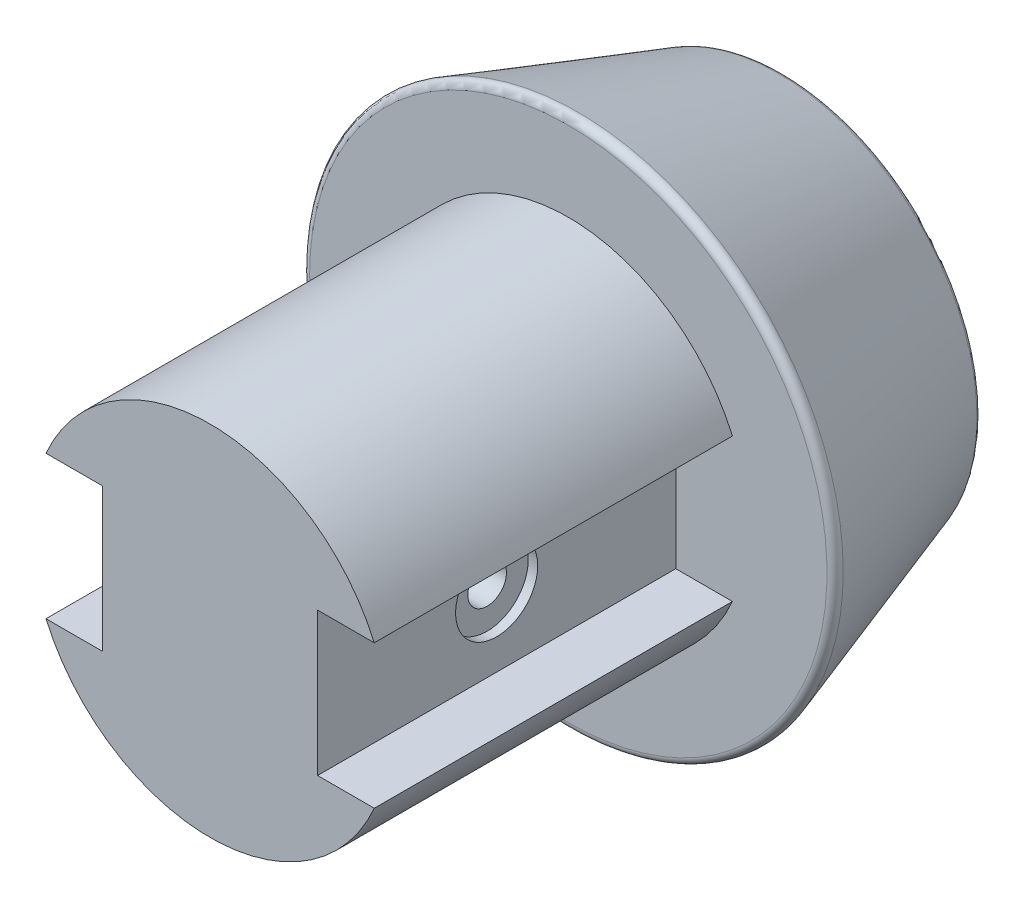
ISO-10303-21;
HEADER;
FILE_DESCRIPTION(('STEP AP214'),'2;1');
FILE_NAME('part.step','',(''),(''),'','','');
FILE_SCHEMA(('AUTOMOTIVE_DESIGN { 1 0 10303 214 1 1 1 1 }'));
ENDSEC;
DATA;
#1=APPLICATION_CONTEXT('core data for automotive mechanical design processes');
#2=APPLICATION_PROTOCOL_DEFINITION('international standard','automotive_design',2000,#1);
#3=PRODUCT_CONTEXT('',#1,'mechanical');
#4=PRODUCT('Part','Part','',(#3));
#5=PRODUCT_RELATED_PRODUCT_CATEGORY('part','',(#4));
#6=PRODUCT_DEFINITION_FORMATION('','',#4);
#7=PRODUCT_DEFINITION_CONTEXT('part definition',#1,'design');
#8=PRODUCT_DEFINITION('design','',#6,#7);
#9=PRODUCT_DEFINITION_SHAPE('','',#8);
#10=(LENGTH_UNIT() NAMED_UNIT(*) SI_UNIT(.MILLI.,.METRE.));
#11=(NAMED_UNIT(*) PLANE_ANGLE_UNIT() SI_UNIT($,.RADIAN.));
#12=(NAMED_UNIT(*) SI_UNIT($,.STERADIAN.) SOLID_ANGLE_UNIT());
#13=UNCERTAINTY_MEASURE_WITH_UNIT(LENGTH_MEASURE(1.E-05),#10,'distance_accuracy_value','');
#14=(GEOMETRIC_REPRESENTATION_CONTEXT(3) GLOBAL_UNCERTAINTY_ASSIGNED_CONTEXT((#13)) GLOBAL_UNIT_ASSIGNED_CONTEXT((#10,
#11,#12)) REPRESENTATION_CONTEXT('',''));
#15=CARTESIAN_POINT('',(0.,0.,0.));
#16=DIRECTION('',(0.,0.,1.));
#17=DIRECTION('',(1.,0.,0.));
#18=AXIS2_PLACEMENT_3D('',#15,#16,#17);
#19=CARTESIAN_POINT('',(2.51141975415989E-06,-0.0477062091716999,18.7400807999406));
#20=DIRECTION('',(0.,0.,-1.));
#21=DIRECTION('',(-1.,0.,0.));
#22=AXIS2_PLACEMENT_3D('',#19,#20,#21);
#23=CYLINDRICAL_SURFACE('',#22,9.525);
#24=CARTESIAN_POINT('',(2.51141975415989E-06,-0.0477062091716999,-0.309919200059446));
#25=DIRECTION('',(0.,0.,1.));
#26=DIRECTION('',(1.,0.,0.));
#27=AXIS2_PLACEMENT_3D('',#24,#25,#26);
#28=CIRCLE('',#27,9.525);
#29=CARTESIAN_POINT('',(-8.72980418747112,-3.8577062091717,-0.309919200059446));
#30=VERTEX_POINT('',#29);
#31=CARTESIAN_POINT('',(8.72980921031063,-3.8577062091717,-0.309919200059446));
#32=VERTEX_POINT('',#31);
#33=EDGE_CURVE('E123',#30,#32,#28,.T.);
#34=ORIENTED_EDGE('',*,*,#33,.T.);
#35=DIRECTION('',(0.,0.,-1.));
#36=VECTOR('',#35,1.);
#37=CARTESIAN_POINT('',(8.72980921031063,-3.8577062091717,18.7400807999406));
#38=LINE('',#37,#36);
#39=CARTESIAN_POINT('',(8.72980921031063,-3.8577062091717,18.7400807999406));
#40=VERTEX_POINT('',#39);
#41=EDGE_CURVE('E158',#40,#32,#38,.T.);
#42=ORIENTED_EDGE('',*,*,#41,.F.);
#43=CARTESIAN_POINT('',(2.51141975415989E-06,-0.0477062091716999,18.7400807999406));
#44=DIRECTION('',(0.,0.,1.));
#45=DIRECTION('',(1.,0.,0.));
#46=AXIS2_PLACEMENT_3D('',#43,#44,#45);
#47=CIRCLE('',#46,9.525);
#48=CARTESIAN_POINT('',(-8.72980418747112,-3.8577062091717,18.7400807999406));
#49=VERTEX_POINT('',#48);
#50=EDGE_CURVE('E478',#49,#40,#47,.T.);
#51=ORIENTED_EDGE('',*,*,#50,.F.);
#52=DIRECTION('',(0.,0.,-1.));
#53=VECTOR('',#52,1.);
#54=CARTESIAN_POINT('',(-8.72980418747112,-3.8577062091717,18.7400807999406));
#55=LINE('',#54,#53);
#56=EDGE_CURVE('E161',#49,#30,#55,.T.);
#57=ORIENTED_EDGE('',*,*,#56,.T.);
#58=EDGE_LOOP('',(#34,#42,#51,#57));
#59=FACE_BOUND('',#58,.T.);
#60=CARTESIAN_POINT('',(2.51141975415989E-06,-9.5727062091717,5.78608079994056));
#61=CARTESIAN_POINT('',(0.186223691914289,-9.57270931231071,5.78607651618651));
#62=CARTESIAN_POINT('',(0.372414521093838,-9.56719644496941,5.80129889142541));
#63=CARTESIAN_POINT('',(0.739260753338305,-9.54575233468766,5.86156241569547));
#64=CARTESIAN_POINT('',(0.919916461384028,-9.52982166684439,5.90660191872387));
#65=CARTESIAN_POINT('',(1.27035042185932,-9.48925987099613,6.02472001317582));
#66=CARTESIAN_POINT('',(1.4401479700598,-9.46464471391828,6.09774715596904));
#67=CARTESIAN_POINT('',(1.76507694755041,-9.40918791081896,6.26951666840495));
#68=CARTESIAN_POINT('',(1.92020478031994,-9.3783447436801,6.3682653219325));
#69=CARTESIAN_POINT('',(2.21753456170161,-9.31227363200444,6.59276824236908));
#70=CARTESIAN_POINT('',(2.35907726973731,-9.27692845316302,6.71936082005124));
#71=CARTESIAN_POINT('',(2.61944483413092,-9.20643838361259,6.99417786918882));
#72=CARTESIAN_POINT('',(2.73826350559995,-9.17129354995033,7.14240821057631));
#73=CARTESIAN_POINT('',(2.95383978709028,-9.1038475295203,7.46254450519243));
#74=CARTESIAN_POINT('',(3.04969401475931,-9.07168642803273,7.63509121426076));
#75=CARTESIAN_POINT('',(3.21073305359389,-9.01565795497707,7.9951989889692));
#76=CARTESIAN_POINT('',(3.27592902493707,-8.99178756626319,8.1827545619647));
#77=CARTESIAN_POINT('',(3.37124596907679,-8.9562894489197,8.55999665351198));
#78=CARTESIAN_POINT('',(3.40261721808463,-8.94422696260857,8.74932503931964));
#79=CARTESIAN_POINT('',(3.43330386974441,-8.93243264293688,9.1309133163772));
#80=CARTESIAN_POINT('',(3.4326312129983,-8.93269621648469,9.32317208897256));
#81=CARTESIAN_POINT('',(3.40021055844797,-8.94514707222822,9.6940255222238));
#82=CARTESIAN_POINT('',(3.37015700060886,-8.95668417610732,9.87279409261143));
#83=CARTESIAN_POINT('',(3.28261505331674,-8.98930780772204,10.2225566355318));
#84=CARTESIAN_POINT('',(3.22512285705964,-9.01039566049649,10.3935495256694));
#85=CARTESIAN_POINT('',(3.08334031943826,-9.06016227330174,10.726506219869));
#86=CARTESIAN_POINT('',(2.99858762916935,-9.08897045310074,10.8882529517267));
#87=CARTESIAN_POINT('',(2.80501148807376,-9.15088451867227,11.1957367232028));
#88=CARTESIAN_POINT('',(2.69618020406556,-9.18399180156598,11.3414685297457));
#89=CARTESIAN_POINT('',(2.44964063337679,-9.25326169138792,11.622220042389));
#90=CARTESIAN_POINT('',(2.31056725353292,-9.2894869291146,11.7560283087964));
#91=CARTESIAN_POINT('',(2.01152499055706,-9.35914790596417,11.9987671801463));
#92=CARTESIAN_POINT('',(1.85155338431714,-9.39258328062664,12.1076945379315));
#93=CARTESIAN_POINT('',(1.51236088861343,-9.4534722884155,12.2987773445362));
#94=CARTESIAN_POINT('',(1.33291300455567,-9.48084078129458,12.3805588894296));
#95=CARTESIAN_POINT('',(0.961578918820591,-9.52588650225517,12.5123802785243));
#96=CARTESIAN_POINT('',(0.769697826036706,-9.54356768303467,12.5624330702673));
#97=CARTESIAN_POINT('',(0.389162364441433,-9.56656659103731,12.6271156424025));
#98=CARTESIAN_POINT('',(0.200819742473156,-9.57245386856479,12.6433787539623));
#99=CARTESIAN_POINT('',(-0.175971867998105,-9.57294235140851,12.6447378500969));
#100=CARTESIAN_POINT('',(-0.364420827436045,-9.56754582970392,12.6298401116321));
#101=CARTESIAN_POINT('',(-0.729212392369129,-9.54644944945529,12.570562302103));
#102=CARTESIAN_POINT('',(-0.905748055846512,-9.53111493418391,12.5272269774352));
#103=CARTESIAN_POINT('',(-1.24893958057587,-9.49204958403294,12.4136537492204));
#104=CARTESIAN_POINT('',(-1.41559415461166,-9.46831765801063,12.3434123494539));
#105=CARTESIAN_POINT('',(-1.73958805954985,-9.41398688998981,12.1758365380667));
#106=CARTESIAN_POINT('',(-1.89652818945035,-9.38321210087654,12.0777890544689));
#107=CARTESIAN_POINT('',(-2.1922338175819,-9.31823386045372,11.8582011108196));
#108=CARTESIAN_POINT('',(-2.33099297379498,-9.28402922002465,11.736652489341));
#109=CARTESIAN_POINT('',(-2.5941286432894,-9.21371129854789,11.4658656387115));
#110=CARTESIAN_POINT('',(-2.71734259974547,-9.17759356363968,11.3154959704249));
#111=CARTESIAN_POINT('',(-2.93698597707621,-9.10932818044551,10.9954742492319));
#112=CARTESIAN_POINT('',(-3.0334139320237,-9.07718074949727,10.8258211417094));
#113=CARTESIAN_POINT('',(-3.19660919739876,-9.0207106473146,10.4712051652051));
#114=CARTESIAN_POINT('',(-3.2633314049545,-8.99639989000752,10.2862195181639));
#115=CARTESIAN_POINT('',(-3.36429041334305,-8.95894148649328,9.90653293205303));
#116=CARTESIAN_POINT('',(-3.39854519918566,-8.94578766043849,9.71183743465413));
#117=CARTESIAN_POINT('',(-3.43206061301721,-8.93291068447955,9.33074188097696));
#118=CARTESIAN_POINT('',(-3.43328361994717,-8.93243440265105,9.14453823735418));
#119=CARTESIAN_POINT('',(-3.40565514094442,-8.94306091549104,8.77473010154212));
#120=CARTESIAN_POINT('',(-3.37680607028785,-8.95416278024639,8.59112540181581));
#121=CARTESIAN_POINT('',(-3.29133218430492,-8.98609115943736,8.23652229029248));
#122=CARTESIAN_POINT('',(-3.23544604313787,-9.00665838279155,8.06532054689741));
#123=CARTESIAN_POINT('',(-3.09811385680193,-9.05506849825302,7.73460924224167));
#124=CARTESIAN_POINT('',(-3.01666160875442,-9.08291315574522,7.57510253004088));
#125=CARTESIAN_POINT('',(-2.82583656225749,-9.14445108226498,7.26376435037916));
#126=CARTESIAN_POINT('',(-2.71528465280415,-9.17836510476964,7.11269965433473));
#127=CARTESIAN_POINT('',(-2.47128489220412,-9.24740312684767,6.83063586649727));
#128=CARTESIAN_POINT('',(-2.33783006144537,-9.28252749265479,6.69964291462417));
#129=CARTESIAN_POINT('',(-2.04410004404319,-9.35206481527934,6.45501986901379));
#130=CARTESIAN_POINT('',(-1.88284124567712,-9.38636160994724,6.34253296810297));
#131=CARTESIAN_POINT('',(-1.54252333394633,-9.44856369138723,6.14633188038207));
#132=CARTESIAN_POINT('',(-1.36346515084571,-9.47646931193499,6.06261619089642));
#133=CARTESIAN_POINT('',(-0.990554093172068,-9.52293931005611,5.92621500022259));
#134=CARTESIAN_POINT('',(-0.796567697976962,-9.5414043948094,5.87385837952821));
#135=CARTESIAN_POINT('',(-0.401706375477897,-9.56628372292093,5.80380062961705));
#136=CARTESIAN_POINT('',(-0.20083428076072,-9.57270286248212,5.78608541990601));
#137=CARTESIAN_POINT('',(2.51141975415989E-06,-9.5727062091717,5.78608079994056));
#138=B_SPLINE_CURVE_WITH_KNOTS('',3,(#60,#61,#62,#63,#64,#65,#66,#67,#68,#69,#70,#71,#72,#73,
#74,#75,#76,#77,#78,#79,#80,#81,#82,#83,#84,#85,#86,#87,#88,#89,#90,#91,#92,#93,#94,#95,#96,#97,
#98,#99,#100,#101,#102,#103,#104,#105,#106,#107,#108,#109,#110,#111,#112,#113,#114,#115,#116,
#117,#118,#119,#120,#121,#122,#123,#124,#125,#126,#127,#128,#129,#130,#131,#132,#133,#134,#135,
#136,#137),.UNSPECIFIED.,.T.,.F.,(4,2,2,2,2,2,2,2,2,2,2,2,2,2,2,2,2,2,2,2,2,2,2,2,2,2,2,2,2,2,2,
2,2,2,2,2,2,2,4),(0.,0.557923364934063,1.11581593324552,1.67268782982926,2.22969590062008,
2.8065909612802,3.3836428149387,3.98061919980658,4.57737810558382,5.15123076463931,
5.72486958919509,6.26726653574069,6.80973875567949,7.36194498169548,7.91433111474944,
8.50071698388387,9.0871793373893,9.68141335664576,10.2754047306615,10.8399441235666,
11.4043698080807,11.9491401730659,12.4939813504296,13.0543027231108,13.6148190336955,
14.2052447153558,14.7957027030921,15.3870541636999,15.9780778591906,16.5339070256564,
17.0896915534541,17.6310825887365,18.172605078608,18.7408408766086,19.3092501516565,
19.9050941750112,20.5009070736292,21.1028639055133,21.7045760125804),.UNSPECIFIED.);
#139=CARTESIAN_POINT('',(2.51141975415989E-06,-9.5727062091717,5.78608079994056));
#140=VERTEX_POINT('',#139);
#141=EDGE_CURVE('E134',#140,#140,#138,.T.);
#142=ORIENTED_EDGE('',*,*,#141,.F.);
#143=EDGE_LOOP('',(#142));
#144=FACE_BOUND('',#143,.T.);
#145=ADVANCED_FACE('F43',(#59,#144),#23,.T.);
#146=CARTESIAN_POINT('',(2.51141975415989E-06,3.7622937908283,18.7400807999406));
#147=DIRECTION('',(0.,1.,0.));
#148=DIRECTION('',(0.,0.,1.));
#149=AXIS2_PLACEMENT_3D('',#146,#147,#148);
#150=PLANE('',#149);
#151=DIRECTION('',(1.,0.,0.));
#152=VECTOR('',#151,1.);
#153=CARTESIAN_POINT('',(2.51141975415989E-06,3.7622937908283,-0.309919200059446));
#154=LINE('',#153,#152);
#155=CARTESIAN_POINT('',(5.71500251141975,3.7622937908283,-0.309919200059446));
#156=VERTEX_POINT('',#155);
#157=CARTESIAN_POINT('',(8.72980921031063,3.7622937908283,-0.309919200059446));
#158=VERTEX_POINT('',#157);
#159=EDGE_CURVE('E116',#156,#158,#154,.T.);
#160=ORIENTED_EDGE('',*,*,#159,.T.);
#161=DIRECTION('',(0.,0.,-1.));
#162=VECTOR('',#161,1.);
#163=CARTESIAN_POINT('',(8.72980921031063,3.7622937908283,18.7400807999406));
#164=LINE('',#163,#162);
#165=CARTESIAN_POINT('',(8.72980921031063,3.7622937908283,18.7400807999406));
#166=VERTEX_POINT('',#165);
#167=EDGE_CURVE('E125',#166,#158,#164,.T.);
#168=ORIENTED_EDGE('',*,*,#167,.F.);
#169=DIRECTION('',(1.,0.,0.));
#170=VECTOR('',#169,1.);
#171=CARTESIAN_POINT('',(2.51141975415989E-06,3.7622937908283,18.7400807999406));
#172=LINE('',#171,#170);
#173=CARTESIAN_POINT('',(5.71500251141975,3.7622937908283,18.7400807999406));
#174=VERTEX_POINT('',#173);
#175=EDGE_CURVE('E153',#174,#166,#172,.T.);
#176=ORIENTED_EDGE('',*,*,#175,.F.);
#177=DIRECTION('',(0.,0.,-1.));
#178=VECTOR('',#177,1.);
#179=CARTESIAN_POINT('',(5.71500251141975,3.7622937908283,18.7400807999406));
#180=LINE('',#179,#178);
#181=EDGE_CURVE('E66',#174,#156,#180,.T.);
#182=ORIENTED_EDGE('',*,*,#181,.T.);
#183=EDGE_LOOP('',(#160,#168,#176,#182));
#184=FACE_BOUND('',#183,.T.);
#185=ADVANCED_FACE('F133',(#184),#150,.F.);
#186=CARTESIAN_POINT('',(-8.72980418747112,3.7622937908283,-0.309919200059446));
#187=VERTEX_POINT('',#186);
#188=EDGE_CURVE('E112',#158,#187,#28,.T.);
#189=ORIENTED_EDGE('',*,*,#188,.T.);
#190=DIRECTION('',(0.,0.,-1.));
#191=VECTOR('',#190,1.);
#192=CARTESIAN_POINT('',(-8.72980418747112,3.7622937908283,18.7400807999406));
#193=LINE('',#192,#191);
#194=CARTESIAN_POINT('',(-8.72980418747112,3.7622937908283,18.7400807999406));
#195=VERTEX_POINT('',#194);
#196=EDGE_CURVE('E131',#195,#187,#193,.T.);
#197=ORIENTED_EDGE('',*,*,#196,.F.);
#198=EDGE_CURVE('E127',#166,#195,#47,.T.);
#199=ORIENTED_EDGE('',*,*,#198,.F.);
#200=ORIENTED_EDGE('',*,*,#167,.T.);
#201=EDGE_LOOP('',(#189,#197,#199,#200));
#202=FACE_BOUND('',#201,.T.);
#203=ADVANCED_FACE('F126',(#202),#23,.T.);
#204=CARTESIAN_POINT('',(2.51141975415989E-06,3.7622937908283,18.7400807999406));
#205=DIRECTION('',(0.,1.,0.));
#206=DIRECTION('',(0.,0.,1.));
#207=AXIS2_PLACEMENT_3D('',#204,#205,#206);
#208=PLANE('',#207);
#209=DIRECTION('',(1.,0.,0.));
#210=VECTOR('',#209,1.);
#211=CARTESIAN_POINT('',(2.51141975415989E-06,3.7622937908283,-0.309919200059446));
#212=LINE('',#211,#210);
#213=CARTESIAN_POINT('',(-5.71499748858025,3.7622937908283,-0.309919200059446));
#214=VERTEX_POINT('',#213);
#215=EDGE_CURVE('E118',#187,#214,#212,.T.);
#216=ORIENTED_EDGE('',*,*,#215,.T.);
#217=DIRECTION('',(0.,0.,-1.));
#218=VECTOR('',#217,1.);
#219=CARTESIAN_POINT('',(-5.71499748858025,3.7622937908283,18.7400807999406));
#220=LINE('',#219,#218);
#221=CARTESIAN_POINT('',(-5.71499748858025,3.7622937908283,18.7400807999406));
#222=VERTEX_POINT('',#221);
#223=EDGE_CURVE('E167',#222,#214,#220,.T.);
#224=ORIENTED_EDGE('',*,*,#223,.F.);
#225=DIRECTION('',(1.,0.,0.));
#226=VECTOR('',#225,1.);
#227=CARTESIAN_POINT('',(2.51141975415989E-06,3.7622937908283,18.7400807999406));
#228=LINE('',#227,#226);
#229=EDGE_CURVE('E477',#195,#222,#228,.T.);
#230=ORIENTED_EDGE('',*,*,#229,.F.);
#231=ORIENTED_EDGE('',*,*,#196,.T.);
#232=EDGE_LOOP('',(#216,#224,#230,#231));
#233=FACE_BOUND('',#232,.T.);
#234=ADVANCED_FACE('F235',(#233),#208,.F.);
#235=CARTESIAN_POINT('',(-5.71499748858025,-0.0477062091716999,18.7400807999406));
#236=DIRECTION('',(1.,0.,0.));
#237=DIRECTION('',(0.,0.,-1.));
#238=AXIS2_PLACEMENT_3D('',#235,#236,#237);
#239=PLANE('',#238);
#240=CARTESIAN_POINT('',(-5.71500251141975,-0.0477062091717003,9.21508079994056));
#241=DIRECTION('',(-1.,0.,0.));
#242=DIRECTION('',(0.,0.,1.));
#243=AXIS2_PLACEMENT_3D('',#240,#241,#242);
#244=CIRCLE('',#243,2.18312999999999);
#245=CARTESIAN_POINT('',(-5.71500251141975,-0.0477062091717003,11.3982107999405));
#246=VERTEX_POINT('',#245);
#247=EDGE_CURVE('E457',#246,#246,#244,.T.);
#248=ORIENTED_EDGE('',*,*,#247,.F.);
#249=EDGE_LOOP('',(#248));
#250=FACE_BOUND('',#249,.T.);
#251=DIRECTION('',(0.,-1.,0.));
#252=VECTOR('',#251,1.);
#253=CARTESIAN_POINT('',(-5.71499748858025,-0.0477062091716999,-0.309919200059446));
#254=LINE('',#253,#252);
#255=CARTESIAN_POINT('',(-5.71499748858025,-3.8577062091717,-0.309919200059446));
#256=VERTEX_POINT('',#255);
#257=EDGE_CURVE('E144',#214,#256,#254,.T.);
#258=ORIENTED_EDGE('',*,*,#257,.T.);
#259=DIRECTION('',(0.,0.,-1.));
#260=VECTOR('',#259,1.);
#261=CARTESIAN_POINT('',(-5.71499748858025,-3.8577062091717,18.7400807999406));
#262=LINE('',#261,#260);
#263=CARTESIAN_POINT('',(-5.71499748858025,-3.8577062091717,18.7400807999406));
#264=VERTEX_POINT('',#263);
#265=EDGE_CURVE('E164',#264,#256,#262,.T.);
#266=ORIENTED_EDGE('',*,*,#265,.F.);
#267=DIRECTION('',(0.,-1.,0.));
#268=VECTOR('',#267,1.);
#269=CARTESIAN_POINT('',(-5.71499748858025,-0.0477062091716999,18.7400807999406));
#270=LINE('',#269,#268);
#271=EDGE_CURVE('E480',#222,#264,#270,.T.);
#272=ORIENTED_EDGE('',*,*,#271,.F.);
#273=ORIENTED_EDGE('',*,*,#223,.T.);
#274=EDGE_LOOP('',(#258,#266,#272,#273));
#275=FACE_BOUND('',#274,.T.);
#276=ADVANCED_FACE('F223',(#250,#275),#239,.F.);
#277=CARTESIAN_POINT('',(2.51141975415989E-06,-3.8577062091717,18.7400807999406));
#278=DIRECTION('',(0.,1.,0.));
#279=DIRECTION('',(0.,0.,1.));
#280=AXIS2_PLACEMENT_3D('',#277,#278,#279);
#281=PLANE('',#280);
#282=DIRECTION('',(1.,0.,0.));
#283=VECTOR('',#282,1.);
#284=CARTESIAN_POINT('',(2.51141975415989E-06,-3.8577062091717,-0.309919200059446));
#285=LINE('',#284,#283);
#286=EDGE_CURVE('E147',#30,#256,#285,.T.);
#287=ORIENTED_EDGE('',*,*,#286,.F.);
#288=ORIENTED_EDGE('',*,*,#56,.F.);
#289=DIRECTION('',(1.,0.,0.));
#290=VECTOR('',#289,1.);
#291=CARTESIAN_POINT('',(2.51141975415989E-06,-3.8577062091717,18.7400807999406));
#292=LINE('',#291,#290);
#293=EDGE_CURVE('E482',#49,#264,#292,.T.);
#294=ORIENTED_EDGE('',*,*,#293,.T.);
#295=ORIENTED_EDGE('',*,*,#265,.T.);
#296=EDGE_LOOP('',(#287,#288,#294,#295));
#297=FACE_BOUND('',#296,.T.);
#298=ADVANCED_FACE('F218',(#297),#281,.T.);
#299=CARTESIAN_POINT('',(2.51141975415989E-06,-3.8577062091717,18.7400807999406));
#300=DIRECTION('',(0.,1.,0.));
#301=DIRECTION('',(0.,0.,1.));
#302=AXIS2_PLACEMENT_3D('',#299,#300,#301);
#303=PLANE('',#302);
#304=DIRECTION('',(1.,0.,0.));
#305=VECTOR('',#304,1.);
#306=CARTESIAN_POINT('',(2.51141975415989E-06,-3.8577062091717,-0.309919200059446));
#307=LINE('',#306,#305);
#308=CARTESIAN_POINT('',(5.71500251141975,-3.8577062091717,-0.309919200059446));
#309=VERTEX_POINT('',#308);
#310=EDGE_CURVE('E149',#309,#32,#307,.T.);
#311=ORIENTED_EDGE('',*,*,#310,.F.);
#312=DIRECTION('',(0.,0.,-1.));
#313=VECTOR('',#312,1.);
#314=CARTESIAN_POINT('',(5.71500251141975,-3.8577062091717,18.7400807999406));
#315=LINE('',#314,#313);
#316=CARTESIAN_POINT('',(5.71500251141975,-3.8577062091717,18.7400807999406));
#317=VERTEX_POINT('',#316);
#318=EDGE_CURVE('E155',#317,#309,#315,.T.);
#319=ORIENTED_EDGE('',*,*,#318,.F.);
#320=DIRECTION('',(1.,0.,0.));
#321=VECTOR('',#320,1.);
#322=CARTESIAN_POINT('',(2.51141975415989E-06,-3.8577062091717,18.7400807999406));
#323=LINE('',#322,#321);
#324=EDGE_CURVE('E484',#317,#40,#323,.T.);
#325=ORIENTED_EDGE('',*,*,#324,.T.);
#326=ORIENTED_EDGE('',*,*,#41,.T.);
#327=EDGE_LOOP('',(#311,#319,#325,#326));
#328=FACE_BOUND('',#327,.T.);
#329=ADVANCED_FACE('F215',(#328),#303,.T.);
#330=CARTESIAN_POINT('',(5.71500251141975,-0.0477062091716999,18.7400807999406));
#331=DIRECTION('',(1.,0.,0.));
#332=DIRECTION('',(0.,0.,-1.));
#333=AXIS2_PLACEMENT_3D('',#330,#331,#332);
#334=PLANE('',#333);
#335=CARTESIAN_POINT('',(5.71500251141975,-0.0477062091717003,9.21508079994056));
#336=DIRECTION('',(1.,0.,0.));
#337=DIRECTION('',(0.,0.,-1.));
#338=AXIS2_PLACEMENT_3D('',#335,#336,#337);
#339=CIRCLE('',#338,2.18312999999999);
#340=CARTESIAN_POINT('',(5.71500251141975,-0.0477062091717003,7.03195079994056));
#341=VERTEX_POINT('',#340);
#342=EDGE_CURVE('E464',#341,#341,#339,.T.);
#343=ORIENTED_EDGE('',*,*,#342,.F.);
#344=EDGE_LOOP('',(#343));
#345=FACE_BOUND('',#344,.T.);
#346=DIRECTION('',(0.,-1.,0.));
#347=VECTOR('',#346,1.);
#348=CARTESIAN_POINT('',(5.71500251141975,-0.0477062091716999,-0.309919200059446));
#349=LINE('',#348,#347);
#350=EDGE_CURVE('E151',#156,#309,#349,.T.);
#351=ORIENTED_EDGE('',*,*,#350,.F.);
#352=ORIENTED_EDGE('',*,*,#181,.F.);
#353=DIRECTION('',(0.,-1.,0.));
#354=VECTOR('',#353,1.);
#355=CARTESIAN_POINT('',(5.71500251141975,-0.0477062091716999,18.7400807999406));
#356=LINE('',#355,#354);
#357=EDGE_CURVE('E140',#174,#317,#356,.T.);
#358=ORIENTED_EDGE('',*,*,#357,.T.);
#359=ORIENTED_EDGE('',*,*,#318,.T.);
#360=EDGE_LOOP('',(#351,#352,#358,#359));
#361=FACE_BOUND('',#360,.T.);
#362=ADVANCED_FACE('F212',(#345,#361),#334,.T.);
#363=CARTESIAN_POINT('',(2.51141975415989E-06,-0.0477062091716999,18.7400807999406));
#364=DIRECTION('',(0.,0.,1.));
#365=DIRECTION('',(1.,0.,0.));
#366=AXIS2_PLACEMENT_3D('',#363,#364,#365);
#367=PLANE('',#366);
#368=ORIENTED_EDGE('',*,*,#175,.T.);
#369=ORIENTED_EDGE('',*,*,#198,.T.);
#370=ORIENTED_EDGE('',*,*,#229,.T.);
#371=ORIENTED_EDGE('',*,*,#271,.T.);
#372=ORIENTED_EDGE('',*,*,#293,.F.);
#373=ORIENTED_EDGE('',*,*,#50,.T.);
#374=ORIENTED_EDGE('',*,*,#324,.F.);
#375=ORIENTED_EDGE('',*,*,#357,.F.);
#376=EDGE_LOOP('',(#368,#369,#370,#371,#372,#373,#374,#375));
#377=FACE_BOUND('',#376,.T.);
#378=ADVANCED_FACE('F208',(#377),#367,.T.);
#379=CARTESIAN_POINT('',(2.51141975415989E-06,-0.0477062091716999,-11.7399192000594));
#380=DIRECTION('',(0.,0.,1.));
#381=DIRECTION('',(1.,0.,0.));
#382=AXIS2_PLACEMENT_3D('',#379,#380,#381);
#383=PLANE('',#382);
#384=CARTESIAN_POINT('',(2.51141975415989E-06,-0.0477062091716999,-11.7399192000594));
#385=DIRECTION('',(0.,0.,1.));
#386=DIRECTION('',(1.,0.,0.));
#387=AXIS2_PLACEMENT_3D('',#384,#385,#386);
#388=CIRCLE('',#387,10.2028907371586);
#389=CARTESIAN_POINT('',(10.2028932485784,-0.0477062091716999,-11.7399192000594));
#390=VERTEX_POINT('',#389);
#391=EDGE_CURVE('E58',#390,#390,#388,.F.);
#392=ORIENTED_EDGE('',*,*,#391,.T.);
#393=EDGE_LOOP('',(#392));
#394=FACE_BOUND('',#393,.T.);
#395=ADVANCED_FACE('F200',(#394),#383,.F.);
#396=CARTESIAN_POINT('',(2.51141975415989E-06,-0.0477062091716999,-0.309919200059446));
#397=DIRECTION('',(0.,0.,-1.));
#398=DIRECTION('',(-1.,0.,0.));
#399=AXIS2_PLACEMENT_3D('',#396,#397,#398);
#400=PLANE('',#399);
#401=CARTESIAN_POINT('',(2.51141975415989E-06,-0.0477062091716999,-0.309919200059446));
#402=DIRECTION('',(0.,0.,-1.));
#403=DIRECTION('',(-1.,0.,0.));
#404=AXIS2_PLACEMENT_3D('',#401,#402,#403);
#405=CIRCLE('',#404,13.7588907371586);
#406=CARTESIAN_POINT('',(-13.7588882257389,-0.0477062091716999,-0.309919200059446));
#407=VERTEX_POINT('',#406);
#408=EDGE_CURVE('E12',#407,#407,#405,.F.);
#409=ORIENTED_EDGE('',*,*,#408,.T.);
#410=EDGE_LOOP('',(#409));
#411=FACE_BOUND('',#410,.T.);
#412=ORIENTED_EDGE('',*,*,#159,.F.);
#413=ORIENTED_EDGE('',*,*,#350,.T.);
#414=ORIENTED_EDGE('',*,*,#310,.T.);
#415=ORIENTED_EDGE('',*,*,#33,.F.);
#416=ORIENTED_EDGE('',*,*,#286,.T.);
#417=ORIENTED_EDGE('',*,*,#257,.F.);
#418=ORIENTED_EDGE('',*,*,#215,.F.);
#419=ORIENTED_EDGE('',*,*,#188,.F.);
#420=EDGE_LOOP('',(#412,#413,#414,#415,#416,#417,#418,#419));
#421=FACE_BOUND('',#420,.T.);
#422=ADVANCED_FACE('F114',(#411,#421),#400,.F.);
#423=CARTESIAN_POINT('',(2.51141975415989E-06,-0.0477062091716999,-11.7399192000594));
#424=DIRECTION('',(0.,0.,1.));
#425=DIRECTION('',(1.,0.,0.));
#426=AXIS2_PLACEMENT_3D('',#423,#424,#425);
#427=CONICAL_SURFACE('',#426,10.4775,0.321750554396642);
#428=CARTESIAN_POINT('',(2.51141975415989E-06,-0.0477062091716999,-11.4794019789119));
#429=DIRECTION('',(0.,0.,1.));
#430=DIRECTION('',(1.,0.,0.));
#431=AXIS2_PLACEMENT_3D('',#428,#429,#430);
#432=CIRCLE('',#431,10.5643390737159);
#433=CARTESIAN_POINT('',(10.5643415851356,-0.0477062091716999,-11.4794019789119));
#434=VERTEX_POINT('',#433);
#435=EDGE_CURVE('E173',#434,#434,#432,.T.);
#436=ORIENTED_EDGE('',*,*,#435,.T.);
#437=EDGE_LOOP('',(#436));
#438=FACE_BOUND('',#437,.T.);
#439=CARTESIAN_POINT('',(2.51141975415989E-06,-0.0477062091716999,-0.811401978911861));
#440=DIRECTION('',(0.,0.,1.));
#441=DIRECTION('',(1.,0.,0.));
#442=AXIS2_PLACEMENT_3D('',#439,#440,#441);
#443=CIRCLE('',#442,14.1203390737159);
#444=CARTESIAN_POINT('',(14.1203415851356,-0.0477062091716999,-0.811401978911861));
#445=VERTEX_POINT('',#444);
#446=EDGE_CURVE('E130',#445,#445,#443,.F.);
#447=ORIENTED_EDGE('',*,*,#446,.T.);
#448=EDGE_LOOP('',(#447));
#449=FACE_BOUND('',#448,.T.);
#450=ADVANCED_FACE('F199',(#438,#449),#427,.T.);
#451=CARTESIAN_POINT('',(2.51141975415989E-06,-0.0477062091716999,-11.3589192000594));
#452=DIRECTION('',(0.,0.,1.));
#453=DIRECTION('',(1.,0.,0.));
#454=AXIS2_PLACEMENT_3D('',#451,#452,#453);
#455=TOROIDAL_SURFACE('',#454,10.2028907371586,0.381);
#456=ORIENTED_EDGE('',*,*,#391,.F.);
#457=EDGE_LOOP('',(#456));
#458=FACE_BOUND('',#457,.T.);
#459=ORIENTED_EDGE('',*,*,#435,.F.);
#460=EDGE_LOOP('',(#459));
#461=FACE_BOUND('',#460,.T.);
#462=ADVANCED_FACE('F204',(#458,#461),#455,.T.);
#463=CARTESIAN_POINT('',(2.51141975415989E-06,-0.0477062091716999,-0.690919200059446));
#464=DIRECTION('',(0.,0.,-1.));
#465=DIRECTION('',(-1.,0.,0.));
#466=AXIS2_PLACEMENT_3D('',#463,#464,#465);
#467=TOROIDAL_SURFACE('',#466,13.7588907371586,0.381);
#468=ORIENTED_EDGE('',*,*,#408,.F.);
#469=EDGE_LOOP('',(#468));
#470=FACE_BOUND('',#469,.T.);
#471=ORIENTED_EDGE('',*,*,#446,.F.);
#472=EDGE_LOOP('',(#471));
#473=FACE_BOUND('',#472,.T.);
#474=ADVANCED_FACE('F45',(#470,#473),#467,.T.);
#475=CARTESIAN_POINT('',(2.51141975415989E-06,3.7622937908283,9.21508079994056));
#476=DIRECTION('',(0.,-1.,0.));
#477=DIRECTION('',(0.,0.,-1.));
#478=AXIS2_PLACEMENT_3D('',#475,#476,#477);
#479=CYLINDRICAL_SURFACE('',#478,3.429);
#480=CARTESIAN_POINT('',(-3.27105501023895,-0.0477062091717003,8.18638079994056));
#481=CARTESIAN_POINT('',(-3.27105559355431,0.00866281179007473,8.18638150196523));
#482=CARTESIAN_POINT('',(-3.27252803762897,0.065038778695429,8.19102978211748));
#483=CARTESIAN_POINT('',(-3.27823518358158,0.176142510951496,8.20945217871246));
#484=CARTESIAN_POINT('',(-3.28247080840064,0.230869719201658,8.22322934435512));
#485=CARTESIAN_POINT('',(-3.29318235915969,0.337051407493567,8.25939961801948));
#486=CARTESIAN_POINT('',(-3.29965455719939,0.3885111657951,8.28177839587598));
#487=CARTESIAN_POINT('',(-3.31410495206309,0.486958513157846,8.33446955842625));
#488=CARTESIAN_POINT('',(-3.322083374287,0.533945431292884,8.36478313079034));
#489=CARTESIAN_POINT('',(-3.33893042943022,0.6236003614875,8.4335105160376));
#490=CARTESIAN_POINT('',(-3.34781802797608,0.666105907640194,8.47213166512896));
#491=CARTESIAN_POINT('',(-3.36532001174789,0.744144497844943,8.55593356820838));
#492=CARTESIAN_POINT('',(-3.37393436173536,0.779676645638736,8.6011151640833));
#493=CARTESIAN_POINT('',(-3.39013467416421,0.843465310374072,8.69791117590167));
#494=CARTESIAN_POINT('',(-3.39769568612006,0.871556175311202,8.74963929810846));
#495=CARTESIAN_POINT('',(-3.4107170501247,0.918577253079797,8.85735061814625));
#496=CARTESIAN_POINT('',(-3.41617785516871,0.937509441580531,8.91333289527213));
#497=CARTESIAN_POINT('',(-3.42424932487276,0.965138095576175,9.02626370180633));
#498=CARTESIAN_POINT('',(-3.42693705301914,0.974111875372524,9.08313877853804));
#499=CARTESIAN_POINT('',(-3.42943092447651,0.982445852070826,9.19764651321328));
#500=CARTESIAN_POINT('',(-3.42923767302981,0.981808068190164,9.2552790094947));
#501=CARTESIAN_POINT('',(-3.42604583156175,0.971123161581493,9.36772009913694));
#502=CARTESIAN_POINT('',(-3.42313678034794,0.96137634891349,9.42256017228899));
#503=CARTESIAN_POINT('',(-3.41494902722839,0.933240620603415,9.52978702251944));
#504=CARTESIAN_POINT('',(-3.40967017525768,0.914851157671815,9.58217364400376));
#505=CARTESIAN_POINT('',(-3.39721217410892,0.86974878516785,9.68372039635226));
#506=CARTESIAN_POINT('',(-3.39001160802342,0.842941425943071,9.73283584130803));
#507=CARTESIAN_POINT('',(-3.37447392414438,0.781838943633023,9.82596721322104));
#508=CARTESIAN_POINT('',(-3.36613653688692,0.747542044117952,9.86998192654786));
#509=CARTESIAN_POINT('',(-3.34883810182934,0.67087657336284,9.95345455817369));
#510=CARTESIAN_POINT('',(-3.33986540209957,0.628247815757658,9.99267141317964));
#511=CARTESIAN_POINT('',(-3.32258862264395,0.536931420559347,10.0634678742007));
#512=CARTESIAN_POINT('',(-3.31428460941862,0.488243181576536,10.0950467212439));
#513=CARTESIAN_POINT('',(-3.29922974872784,0.385555162817169,10.1499221799511));
#514=CARTESIAN_POINT('',(-3.2924945584003,0.331508926774859,10.1731364681326));
#515=CARTESIAN_POINT('',(-3.28152574861026,0.220025167276993,10.2100625025606));
#516=CARTESIAN_POINT('',(-3.27729131313632,0.16258875679232,10.2237773487852));
#517=CARTESIAN_POINT('',(-3.27198254697577,0.0482493078384987,10.2408645745348));
#518=CARTESIAN_POINT('',(-3.27079631338756,-0.0085938171114821,10.2446033922162));
#519=CARTESIAN_POINT('',(-3.27140882722824,-0.122096923995706,10.242655726065));
#520=CARTESIAN_POINT('',(-3.2732071568157,-0.178756930454016,10.2369705615982));
#521=CARTESIAN_POINT('',(-3.27947634492275,-0.288756938788732,10.2166626465319));
#522=CARTESIAN_POINT('',(-3.2838765610077,-0.34214495062486,10.2022759194362));
#523=CARTESIAN_POINT('',(-3.29478053920492,-0.445745688731334,10.165246946136));
#524=CARTESIAN_POINT('',(-3.3012846260893,-0.495957923328968,10.1426034252712));
#525=CARTESIAN_POINT('',(-3.31588050515134,-0.593272086032712,10.0890085726061));
#526=CARTESIAN_POINT('',(-3.32401022557237,-0.640254362823849,10.0578505730371));
#527=CARTESIAN_POINT('',(-3.34085988291184,-0.728457422390403,9.988356658316));
#528=CARTESIAN_POINT('',(-3.34957996077985,-0.769676822010526,9.95001902511888));
#529=CARTESIAN_POINT('',(-3.36702608745223,-0.846786931479472,9.86553132980466));
#530=CARTESIAN_POINT('',(-3.37573994122198,-0.88241782353098,9.81914102890558));
#531=CARTESIAN_POINT('',(-3.39186040187284,-0.945395572736525,9.72083209181255));
#532=CARTESIAN_POINT('',(-3.39926707366673,-0.972742841291824,9.66891373033959));
#533=CARTESIAN_POINT('',(-3.41189343409741,-1.01811323013544,9.56136556906739));
#534=CARTESIAN_POINT('',(-3.41712940016864,-1.03620599585352,9.5057671577341));
#535=CARTESIAN_POINT('',(-3.42489626465531,-1.06273198734675,9.3921337629694));
#536=CARTESIAN_POINT('',(-3.42742793701115,-1.07116797683912,9.33409948160245));
#537=CARTESIAN_POINT('',(-3.42945384789048,-1.07793077278427,9.21964284707334));
#538=CARTESIAN_POINT('',(-3.42906130303369,-1.07663437168239,9.16324448412324));
#539=CARTESIAN_POINT('',(-3.42554972828147,-1.0648699336038,9.05150413975801));
#540=CARTESIAN_POINT('',(-3.42243085297655,-1.05440241665481,8.99616209862831));
#541=CARTESIAN_POINT('',(-3.41384932118165,-1.02482605178384,8.88868401935679));
#542=CARTESIAN_POINT('',(-3.40841219277441,-1.00581120488261,8.83651993556297));
#543=CARTESIAN_POINT('',(-3.39575637194477,-0.959764032202667,8.7360952854902));
#544=CARTESIAN_POINT('',(-3.38853738678488,-0.932730388885426,8.68783536234907));
#545=CARTESIAN_POINT('',(-3.37278908623033,-0.870410092066184,8.59491056211853));
#546=CARTESIAN_POINT('',(-3.36422523482239,-0.834887042477186,8.5504101264379));
#547=CARTESIAN_POINT('',(-3.34686290678205,-0.757022024853053,8.46787593351151));
#548=CARTESIAN_POINT('',(-3.33806436318335,-0.714678092821098,8.42984404531556));
#549=CARTESIAN_POINT('',(-3.32092007635129,-0.622858703406404,8.36018810443272));
#550=CARTESIAN_POINT('',(-3.31259564435767,-0.573208309256728,8.32878881752043));
#551=CARTESIAN_POINT('',(-3.29768425939004,-0.469092470731881,8.27481941776028));
#552=CARTESIAN_POINT('',(-3.29109647203761,-0.414629355505287,8.25224506240891));
#553=CARTESIAN_POINT('',(-3.28105545564784,-0.308488221176753,8.21860007804938));
#554=CARTESIAN_POINT('',(-3.27734073854154,-0.257143599108679,8.20655114484078));
#555=CARTESIAN_POINT('',(-3.27234048664662,-0.153103229581845,8.19044197836989));
#556=CARTESIAN_POINT('',(-3.27105446487519,-0.100407755133612,8.18638014359094));
#557=CARTESIAN_POINT('',(-3.27105501023895,-0.0477062091717003,8.18638079994056));
#558=B_SPLINE_CURVE_WITH_KNOTS('',3,(#480,#481,#482,#483,#484,#485,#486,#487,#488,#489,#490,
#491,#492,#493,#494,#495,#496,#497,#498,#499,#500,#501,#502,#503,#504,#505,#506,#507,#508,#509,
#510,#511,#512,#513,#514,#515,#516,#517,#518,#519,#520,#521,#522,#523,#524,#525,#526,#527,#528,
#529,#530,#531,#532,#533,#534,#535,#536,#537,#538,#539,#540,#541,#542,#543,#544,#545,#546,#547,
#548,#549,#550,#551,#552,#553,#554,#555,#556,#557),.UNSPECIFIED.,.T.,.F.,(4,2,2,2,2,2,2,2,2,2,2,
2,2,2,2,2,2,2,2,2,2,2,2,2,2,2,2,2,2,2,2,2,2,2,2,2,2,2,4),(0.,0.168912653760413,
0.337881755622965,0.506570568993564,0.675284645951464,0.8488362627074,1.02241017065384,
1.1995735114913,1.37669861837431,1.54875681709831,1.72077886998032,1.8873224639981,
2.05387660568885,2.22237062557671,2.39090465373256,2.56593542423828,2.74098358002184,
2.91771030184554,3.09437932476229,3.26446341798975,3.43452370130559,3.60016604399753,
3.76583396891914,3.93594837865592,4.10610354792768,4.28268045274506,4.4592485865365,
4.63446763696977,4.80963652810922,4.97805969213027,5.14647330670863,5.3130784302568,
5.479710943249,5.65167524224681,5.82368914524291,6.00082982475814,6.17788524051186,
6.3358397930615,6.49376267044728),.UNSPECIFIED.);
#559=CARTESIAN_POINT('',(-3.27105501023895,-0.0477062091717003,8.18638079994056));
#560=VERTEX_POINT('',#559);
#561=EDGE_CURVE('E47',#560,#560,#558,.T.);
#562=ORIENTED_EDGE('',*,*,#561,.F.);
#563=EDGE_LOOP('',(#562));
#564=FACE_BOUND('',#563,.T.);
#565=CARTESIAN_POINT('',(3.27106003307846,-0.0477062091717003,8.18638079994056));
#566=CARTESIAN_POINT('',(3.27106061639382,-0.104075230133475,8.18638150196523));
#567=CARTESIAN_POINT('',(3.27253306046848,-0.16045119703883,8.19102978211748));
#568=CARTESIAN_POINT('',(3.27824020642108,-0.271554929294897,8.20945217871246));
#569=CARTESIAN_POINT('',(3.28247583124015,-0.326282137545059,8.22322934435512));
#570=CARTESIAN_POINT('',(3.2931873819992,-0.432463825836968,8.25939961801948));
#571=CARTESIAN_POINT('',(3.2996595800389,-0.4839235841385,8.28177839587598));
#572=CARTESIAN_POINT('',(3.3141099749026,-0.582370931501247,8.33446955842625));
#573=CARTESIAN_POINT('',(3.32208839712651,-0.629357849636285,8.36478313079034));
#574=CARTESIAN_POINT('',(3.33893545226973,-0.719012779830901,8.4335105160376));
#575=CARTESIAN_POINT('',(3.34782305081559,-0.761518325983595,8.47213166512896));
#576=CARTESIAN_POINT('',(3.3653250345874,-0.839556916188344,8.55593356820838));
#577=CARTESIAN_POINT('',(3.37393938457486,-0.875089063982136,8.6011151640833));
#578=CARTESIAN_POINT('',(3.39013969700372,-0.938877728717472,8.69791117590167));
#579=CARTESIAN_POINT('',(3.39770070895957,-0.966968593654602,8.74963929810846));
#580=CARTESIAN_POINT('',(3.4107220729642,-1.0139896714232,8.85735061814625));
#581=CARTESIAN_POINT('',(3.41618287800822,-1.03292185992393,8.91333289527213));
#582=CARTESIAN_POINT('',(3.42425434771227,-1.06055051391958,9.02626370180633));
#583=CARTESIAN_POINT('',(3.42694207585865,-1.06952429371592,9.08313877853804));
#584=CARTESIAN_POINT('',(3.42943594731602,-1.07785827041423,9.19764651321328));
#585=CARTESIAN_POINT('',(3.42924269586931,-1.07722048653356,9.2552790094947));
#586=CARTESIAN_POINT('',(3.42605085440126,-1.06653557992489,9.36772009913694));
#587=CARTESIAN_POINT('',(3.42314180318745,-1.05678876725689,9.42256017228899));
#588=CARTESIAN_POINT('',(3.41495405006789,-1.02865303894682,9.52978702251944));
#589=CARTESIAN_POINT('',(3.40967519809719,-1.01026357601522,9.58217364400376));
#590=CARTESIAN_POINT('',(3.39721719694843,-0.965161203511251,9.68372039635226));
#591=CARTESIAN_POINT('',(3.39001663086292,-0.938353844286472,9.73283584130803));
#592=CARTESIAN_POINT('',(3.37447894698389,-0.877251361976424,9.82596721322104));
#593=CARTESIAN_POINT('',(3.36614155972643,-0.842954462461353,9.86998192654786));
#594=CARTESIAN_POINT('',(3.34884312466884,-0.766288991706241,9.95345455817369));
#595=CARTESIAN_POINT('',(3.33987042493908,-0.723660234101059,9.99267141317964));
#596=CARTESIAN_POINT('',(3.32259364548346,-0.632343838902748,10.0634678742007));
#597=CARTESIAN_POINT('',(3.31428963225813,-0.583655599919936,10.0950467212439));
#598=CARTESIAN_POINT('',(3.29923477156735,-0.48096758116057,10.1499221799511));
#599=CARTESIAN_POINT('',(3.2924995812398,-0.42692134511826,10.1731364681326));
#600=CARTESIAN_POINT('',(3.28153077144977,-0.315437585620394,10.2100625025606));
#601=CARTESIAN_POINT('',(3.27729633597583,-0.258001175135721,10.2237773487852));
#602=CARTESIAN_POINT('',(3.27198756981528,-0.143661726181899,10.2408645745348));
#603=CARTESIAN_POINT('',(3.27080133622707,-0.0868186012319185,10.2446033922162));
#604=CARTESIAN_POINT('',(3.27141385006775,0.0266845056523056,10.242655726065));
#605=CARTESIAN_POINT('',(3.27321217965521,0.0833445121106157,10.2369705615982));
#606=CARTESIAN_POINT('',(3.27948136776226,0.193344520445331,10.2166626465319));
#607=CARTESIAN_POINT('',(3.28388158384721,0.24673253228146,10.2022759194362));
#608=CARTESIAN_POINT('',(3.29478556204443,0.350333270387933,10.165246946136));
#609=CARTESIAN_POINT('',(3.3012896489288,0.400545504985567,10.1426034252712));
#610=CARTESIAN_POINT('',(3.31588552799084,0.497859667689312,10.0890085726061));
#611=CARTESIAN_POINT('',(3.32401524841188,0.544841944480449,10.0578505730371));
#612=CARTESIAN_POINT('',(3.34086490575135,0.633045004047003,9.988356658316));
#613=CARTESIAN_POINT('',(3.34958498361936,0.674264403667125,9.95001902511888));
#614=CARTESIAN_POINT('',(3.36703111029173,0.751374513136071,9.86553132980466));
#615=CARTESIAN_POINT('',(3.37574496406149,0.787005405187579,9.81914102890558));
#616=CARTESIAN_POINT('',(3.39186542471234,0.849983154393125,9.72083209181255));
#617=CARTESIAN_POINT('',(3.39927209650623,0.877330422948423,9.66891373033959));
#618=CARTESIAN_POINT('',(3.41189845693692,0.922700811792037,9.56136556906739));
#619=CARTESIAN_POINT('',(3.41713442300814,0.940793577510124,9.5057671577341));
#620=CARTESIAN_POINT('',(3.42490128749482,0.967319569003349,9.3921337629694));
#621=CARTESIAN_POINT('',(3.42743295985065,0.975755558495722,9.33409948160245));
#622=CARTESIAN_POINT('',(3.42945887072998,0.982518354440874,9.21964284707334));
#623=CARTESIAN_POINT('',(3.4290663258732,0.98122195333899,9.16324448412324));
#624=CARTESIAN_POINT('',(3.42555475112097,0.969457515260401,9.05150413975801));
#625=CARTESIAN_POINT('',(3.42243587581606,0.958989998311411,8.99616209862831));
#626=CARTESIAN_POINT('',(3.41385434402116,0.929413633440436,8.88868401935679));
#627=CARTESIAN_POINT('',(3.40841721561392,0.910398786539206,8.83651993556297));
#628=CARTESIAN_POINT('',(3.39576139478427,0.864351613859267,8.7360952854902));
#629=CARTESIAN_POINT('',(3.38854240962439,0.837317970542026,8.68783536234907));
#630=CARTESIAN_POINT('',(3.37279410906984,0.774997673722784,8.59491056211853));
#631=CARTESIAN_POINT('',(3.3642302576619,0.739474624133787,8.5504101264379));
#632=CARTESIAN_POINT('',(3.34686792962156,0.661609606509654,8.46787593351151));
#633=CARTESIAN_POINT('',(3.33806938602286,0.619265674477698,8.42984404531557));
#634=CARTESIAN_POINT('',(3.32092509919079,0.527446285063003,8.36018810443273));
#635=CARTESIAN_POINT('',(3.31260066719718,0.477795890913328,8.32878881752043));
#636=CARTESIAN_POINT('',(3.29768928222955,0.37368005238848,8.27481941776028));
#637=CARTESIAN_POINT('',(3.29110149487712,0.319216937161886,8.25224506240891));
#638=CARTESIAN_POINT('',(3.28106047848735,0.213075802833352,8.21860007804938));
#639=CARTESIAN_POINT('',(3.27734576138105,0.161731180765278,8.20655114484078));
#640=CARTESIAN_POINT('',(3.27234550948613,0.0576908112384449,8.19044197836989));
#641=CARTESIAN_POINT('',(3.2710594877147,0.00499533679021114,8.18638014359094));
#642=CARTESIAN_POINT('',(3.27106003307846,-0.0477062091717003,8.18638079994056));
#643=B_SPLINE_CURVE_WITH_KNOTS('',3,(#565,#566,#567,#568,#569,#570,#571,#572,#573,#574,#575,
#576,#577,#578,#579,#580,#581,#582,#583,#584,#585,#586,#587,#588,#589,#590,#591,#592,#593,#594,
#595,#596,#597,#598,#599,#600,#601,#602,#603,#604,#605,#606,#607,#608,#609,#610,#611,#612,#613,
#614,#615,#616,#617,#618,#619,#620,#621,#622,#623,#624,#625,#626,#627,#628,#629,#630,#631,#632,
#633,#634,#635,#636,#637,#638,#639,#640,#641,#642),.UNSPECIFIED.,.T.,.F.,(4,2,2,2,2,2,2,2,2,2,2,
2,2,2,2,2,2,2,2,2,2,2,2,2,2,2,2,2,2,2,2,2,2,2,2,2,2,2,4),(0.,0.168912653760413,
0.337881755622965,0.506570568993564,0.675284645951464,0.8488362627074,1.02241017065384,
1.1995735114913,1.37669861837431,1.54875681709831,1.72077886998032,1.8873224639981,
2.05387660568885,2.22237062557671,2.39090465373256,2.56593542423828,2.74098358002184,
2.91771030184554,3.09437932476229,3.26446341798975,3.43452370130559,3.60016604399753,
3.76583396891914,3.93594837865592,4.10610354792768,4.28268045274506,4.4592485865365,
4.63446763696977,4.80963652810922,4.97805969213027,5.14647330670863,5.3130784302568,
5.479710943249,5.6516752422468,5.82368914524291,6.00082982475814,6.17788524051186,
6.3358397930615,6.49376267044728),.UNSPECIFIED.);
#644=CARTESIAN_POINT('',(3.27106003307846,-0.0477062091717003,8.18638079994056));
#645=VERTEX_POINT('',#644);
#646=EDGE_CURVE('E181',#645,#645,#643,.T.);
#647=ORIENTED_EDGE('',*,*,#646,.F.);
#648=EDGE_LOOP('',(#647));
#649=FACE_BOUND('',#648,.T.);
#650=CARTESIAN_POINT('',(2.51141975415989E-06,3.7622937908283,9.21508079994056));
#651=DIRECTION('',(0.,1.,0.));
#652=DIRECTION('',(0.,0.,1.));
#653=AXIS2_PLACEMENT_3D('',#650,#651,#652);
#654=CIRCLE('',#653,3.429);
#655=CARTESIAN_POINT('',(2.51141975415989E-06,3.7622937908283,12.6440807999406));
#656=VERTEX_POINT('',#655);
#657=EDGE_CURVE('E137',#656,#656,#654,.T.);
#658=ORIENTED_EDGE('',*,*,#657,.T.);
#659=EDGE_LOOP('',(#658));
#660=FACE_BOUND('',#659,.T.);
#661=ORIENTED_EDGE('',*,*,#141,.T.);
#662=EDGE_LOOP('',(#661));
#663=FACE_BOUND('',#662,.T.);
#664=ADVANCED_FACE('F188',(#564,#649,#660,#663),#479,.F.);
#665=CARTESIAN_POINT('',(2.51141975415989E-06,3.7622937908283,9.21508079994056));
#666=DIRECTION('',(0.,1.,0.));
#667=DIRECTION('',(0.,0.,1.));
#668=AXIS2_PLACEMENT_3D('',#665,#666,#667);
#669=PLANE('',#668);
#670=ORIENTED_EDGE('',*,*,#657,.F.);
#671=EDGE_LOOP('',(#670));
#672=FACE_BOUND('',#671,.T.);
#673=ADVANCED_FACE('F193',(#672),#669,.F.);
#674=CARTESIAN_POINT('',(5.71500251141975,-0.0477062091717003,9.21508079994056));
#675=DIRECTION('',(1.,0.,0.));
#676=DIRECTION('',(0.,0.,-1.));
#677=AXIS2_PLACEMENT_3D('',#674,#675,#676);
#678=CYLINDRICAL_SURFACE('',#677,2.18313);
#679=CARTESIAN_POINT('',(5.20700251141975,-0.0477062091717003,9.21508079994056));
#680=DIRECTION('',(1.,0.,0.));
#681=DIRECTION('',(0.,0.,-1.));
#682=AXIS2_PLACEMENT_3D('',#679,#680,#681);
#683=CIRCLE('',#682,2.18313);
#684=CARTESIAN_POINT('',(5.20700251141975,-0.0477062091717003,7.03195079994055));
#685=VERTEX_POINT('',#684);
#686=EDGE_CURVE('E467',#685,#685,#683,.T.);
#687=ORIENTED_EDGE('',*,*,#686,.F.);
#688=EDGE_LOOP('',(#687));
#689=FACE_BOUND('',#688,.T.);
#690=ORIENTED_EDGE('',*,*,#342,.T.);
#691=EDGE_LOOP('',(#690));
#692=FACE_BOUND('',#691,.T.);
#693=ADVANCED_FACE('F273',(#689,#692),#678,.F.);
#694=CARTESIAN_POINT('',(5.20700251141975,0.980993790828302,9.21508079994056));
#695=DIRECTION('',(-1.,0.,0.));
#696=DIRECTION('',(0.,0.,1.));
#697=AXIS2_PLACEMENT_3D('',#694,#695,#696);
#698=PLANE('',#697);
#699=CARTESIAN_POINT('',(5.20700251141975,-0.0477062091717003,9.21508079994056));
#700=DIRECTION('',(1.,0.,0.));
#701=DIRECTION('',(0.,0.,-1.));
#702=AXIS2_PLACEMENT_3D('',#699,#700,#701);
#703=CIRCLE('',#702,1.0287);
#704=CARTESIAN_POINT('',(5.20700251141975,-0.0477062091717003,8.18638079994055));
#705=VERTEX_POINT('',#704);
#706=EDGE_CURVE('E470',#705,#705,#703,.T.);
#707=ORIENTED_EDGE('',*,*,#706,.F.);
#708=EDGE_LOOP('',(#707));
#709=FACE_BOUND('',#708,.T.);
#710=ORIENTED_EDGE('',*,*,#686,.T.);
#711=EDGE_LOOP('',(#710));
#712=FACE_BOUND('',#711,.T.);
#713=ADVANCED_FACE('F279',(#709,#712),#698,.F.);
#714=CARTESIAN_POINT('',(5.71500251141975,-0.0477062091717003,9.21508079994056));
#715=DIRECTION('',(1.,0.,0.));
#716=DIRECTION('',(0.,0.,-1.));
#717=AXIS2_PLACEMENT_3D('',#714,#715,#716);
#718=CYLINDRICAL_SURFACE('',#717,1.0287);
#719=ORIENTED_EDGE('',*,*,#646,.T.);
#720=EDGE_LOOP('',(#719));
#721=FACE_BOUND('',#720,.T.);
#722=ORIENTED_EDGE('',*,*,#706,.T.);
#723=EDGE_LOOP('',(#722));
#724=FACE_BOUND('',#723,.T.);
#725=ADVANCED_FACE('F287',(#721,#724),#718,.F.);
#726=CARTESIAN_POINT('',(-5.20700251141975,-0.0477062091717003,9.21508079994056));
#727=DIRECTION('',(-1.,0.,0.));
#728=DIRECTION('',(0.,0.,1.));
#729=AXIS2_PLACEMENT_3D('',#726,#727,#728);
#730=CIRCLE('',#729,1.0287);
#731=CARTESIAN_POINT('',(-5.20700251141975,-0.0477062091717003,10.2437807999406));
#732=VERTEX_POINT('',#731);
#733=EDGE_CURVE('E459',#732,#732,#730,.T.);
#734=ORIENTED_EDGE('',*,*,#733,.T.);
#735=EDGE_LOOP('',(#734));
#736=FACE_BOUND('',#735,.T.);
#737=ORIENTED_EDGE('',*,*,#561,.T.);
#738=EDGE_LOOP('',(#737));
#739=FACE_BOUND('',#738,.T.);
#740=ADVANCED_FACE('F295',(#736,#739),#718,.F.);
#741=CARTESIAN_POINT('',(-5.20700251141975,0.980993790828302,9.21508079994056));
#742=DIRECTION('',(1.,0.,0.));
#743=DIRECTION('',(0.,0.,-1.));
#744=AXIS2_PLACEMENT_3D('',#741,#742,#743);
#745=PLANE('',#744);
#746=ORIENTED_EDGE('',*,*,#733,.F.);
#747=EDGE_LOOP('',(#746));
#748=FACE_BOUND('',#747,.T.);
#749=CARTESIAN_POINT('',(-5.20700251141975,-0.0477062091717003,9.21508079994056));
#750=DIRECTION('',(-1.,0.,0.));
#751=DIRECTION('',(0.,0.,1.));
#752=AXIS2_PLACEMENT_3D('',#749,#750,#751);
#753=CIRCLE('',#752,2.18313);
#754=CARTESIAN_POINT('',(-5.20700251141975,-0.0477062091717003,11.3982107999406));
#755=VERTEX_POINT('',#754);
#756=EDGE_CURVE('E454',#755,#755,#753,.T.);
#757=ORIENTED_EDGE('',*,*,#756,.T.);
#758=EDGE_LOOP('',(#757));
#759=FACE_BOUND('',#758,.T.);
#760=ADVANCED_FACE('F303',(#748,#759),#745,.F.);
#761=CARTESIAN_POINT('',(-5.71500251141975,-0.0477062091717003,9.21508079994056));
#762=DIRECTION('',(-1.,0.,0.));
#763=DIRECTION('',(0.,0.,1.));
#764=AXIS2_PLACEMENT_3D('',#761,#762,#763);
#765=CYLINDRICAL_SURFACE('',#764,2.18313);
#766=ORIENTED_EDGE('',*,*,#756,.F.);
#767=EDGE_LOOP('',(#766));
#768=FACE_BOUND('',#767,.T.);
#769=ORIENTED_EDGE('',*,*,#247,.T.);
#770=EDGE_LOOP('',(#769));
#771=FACE_BOUND('',#770,.T.);
#772=ADVANCED_FACE('F310',(#768,#771),#765,.F.);
#773=CLOSED_SHELL('',(#145,#185,#203,#234,#276,#298,#329,#362,#378,#395,#422,#450,#462,#474,
#664,#673,#693,#713,#725,#740,#760,#772));
#774=MANIFOLD_SOLID_BREP('B2',#773);
#775=ADVANCED_BREP_SHAPE_REPRESENTATION('',(#18,#774),#14);
#776=SHAPE_DEFINITION_REPRESENTATION(#9,#775);
ENDSEC;
END-ISO-10303-21;
